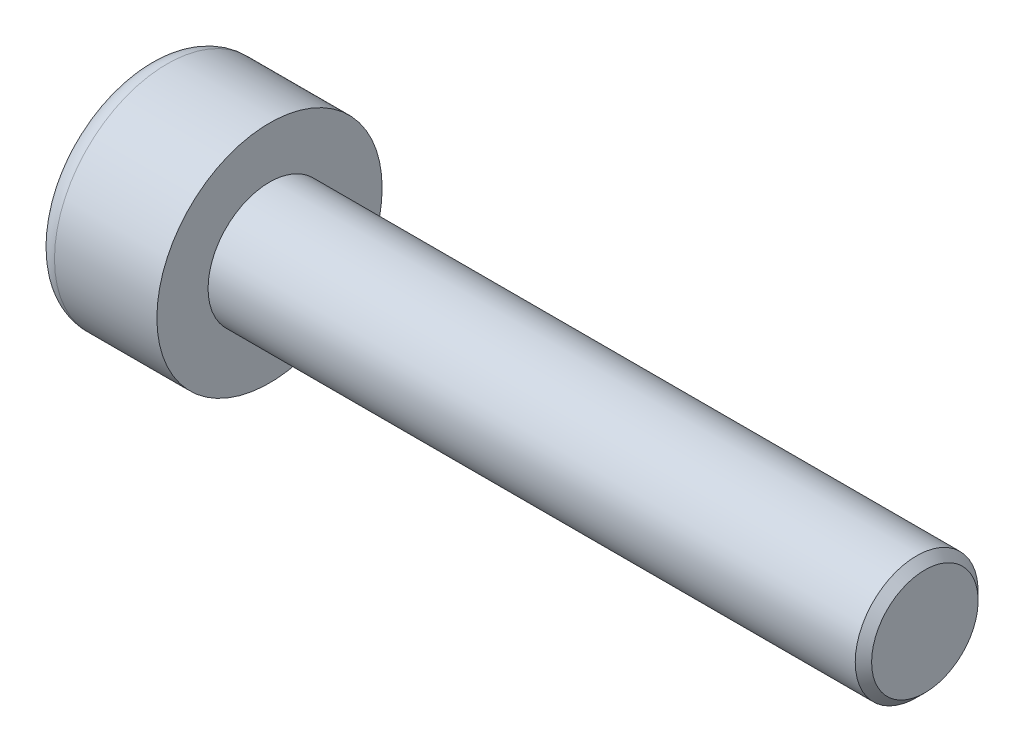
ISO-10303-21;
HEADER;
FILE_DESCRIPTION(('STEP AP214'),'2;1');
FILE_NAME('part.step','',(''),(''),'','','');
FILE_SCHEMA(('AUTOMOTIVE_DESIGN { 1 0 10303 214 1 1 1 1 }'));
ENDSEC;
DATA;
#1=APPLICATION_CONTEXT('core data for automotive mechanical design processes');
#2=APPLICATION_PROTOCOL_DEFINITION('international standard','automotive_design',2000,#1);
#3=PRODUCT_CONTEXT('',#1,'mechanical');
#4=PRODUCT('Part','Part','',(#3));
#5=PRODUCT_RELATED_PRODUCT_CATEGORY('part','',(#4));
#6=PRODUCT_DEFINITION_FORMATION('','',#4);
#7=PRODUCT_DEFINITION_CONTEXT('part definition',#1,'design');
#8=PRODUCT_DEFINITION('design','',#6,#7);
#9=PRODUCT_DEFINITION_SHAPE('','',#8);
#10=(LENGTH_UNIT() NAMED_UNIT(*) SI_UNIT(.MILLI.,.METRE.));
#11=(NAMED_UNIT(*) PLANE_ANGLE_UNIT() SI_UNIT($,.RADIAN.));
#12=(NAMED_UNIT(*) SI_UNIT($,.STERADIAN.) SOLID_ANGLE_UNIT());
#13=UNCERTAINTY_MEASURE_WITH_UNIT(LENGTH_MEASURE(1.E-05),#10,'distance_accuracy_value','');
#14=(GEOMETRIC_REPRESENTATION_CONTEXT(3) GLOBAL_UNCERTAINTY_ASSIGNED_CONTEXT((#13)) GLOBAL_UNIT_ASSIGNED_CONTEXT((#10,
#11,#12)) REPRESENTATION_CONTEXT('',''));
#15=CARTESIAN_POINT('',(0.,0.,0.));
#16=DIRECTION('',(0.,0.,1.));
#17=DIRECTION('',(1.,0.,0.));
#18=AXIS2_PLACEMENT_3D('',#15,#16,#17);
#19=CARTESIAN_POINT('',(0.,0.,0.));
#20=DIRECTION('',(1.,0.,0.));
#21=DIRECTION('',(0.,0.,-1.));
#22=AXIS2_PLACEMENT_3D('',#19,#20,#21);
#23=PLANE('',#22);
#24=DIRECTION('',(0.,0.866025403784439,0.5));
#25=VECTOR('',#24,1.);
#26=CARTESIAN_POINT('',(0.,-1.25,0.721687836487032));
#27=LINE('',#26,#25);
#28=CARTESIAN_POINT('',(0.,-1.25,0.721687836487032));
#29=VERTEX_POINT('',#28);
#30=CARTESIAN_POINT('',(0.,0.,1.44337567297406));
#31=VERTEX_POINT('',#30);
#32=EDGE_CURVE('E91',#29,#31,#27,.T.);
#33=ORIENTED_EDGE('',*,*,#32,.F.);
#34=DIRECTION('',(0.,0.,1.));
#35=VECTOR('',#34,1.);
#36=CARTESIAN_POINT('',(0.,-1.25,-0.721687836487033));
#37=LINE('',#36,#35);
#38=CARTESIAN_POINT('',(0.,-1.25,-0.721687836487033));
#39=VERTEX_POINT('',#38);
#40=EDGE_CURVE('E33',#39,#29,#37,.T.);
#41=ORIENTED_EDGE('',*,*,#40,.F.);
#42=DIRECTION('',(0.,-0.866025403784439,0.5));
#43=VECTOR('',#42,1.);
#44=CARTESIAN_POINT('',(0.,0.,-1.44337567297406));
#45=LINE('',#44,#43);
#46=CARTESIAN_POINT('',(0.,0.,-1.44337567297406));
#47=VERTEX_POINT('',#46);
#48=EDGE_CURVE('E106',#47,#39,#45,.T.);
#49=ORIENTED_EDGE('',*,*,#48,.F.);
#50=DIRECTION('',(0.,-0.866025403784439,-0.5));
#51=VECTOR('',#50,1.);
#52=CARTESIAN_POINT('',(0.,1.25,-0.721687836487033));
#53=LINE('',#52,#51);
#54=CARTESIAN_POINT('',(0.,1.25,-0.721687836487033));
#55=VERTEX_POINT('',#54);
#56=EDGE_CURVE('E100',#55,#47,#53,.T.);
#57=ORIENTED_EDGE('',*,*,#56,.F.);
#58=DIRECTION('',(0.,0.,-1.));
#59=VECTOR('',#58,1.);
#60=CARTESIAN_POINT('',(0.,1.25,0.721687836487032));
#61=LINE('',#60,#59);
#62=CARTESIAN_POINT('',(0.,1.25,0.721687836487032));
#63=VERTEX_POINT('',#62);
#64=EDGE_CURVE('E98',#63,#55,#61,.T.);
#65=ORIENTED_EDGE('',*,*,#64,.F.);
#66=DIRECTION('',(0.,0.866025403784439,-0.5));
#67=VECTOR('',#66,1.);
#68=CARTESIAN_POINT('',(0.,0.,1.44337567297406));
#69=LINE('',#68,#67);
#70=EDGE_CURVE('E84',#31,#63,#69,.T.);
#71=ORIENTED_EDGE('',*,*,#70,.F.);
#72=EDGE_LOOP('',(#33,#41,#49,#57,#65,#71));
#73=FACE_BOUND('',#72,.T.);
#74=CARTESIAN_POINT('',(0.,0.,0.));
#75=DIRECTION('',(-1.,0.,0.));
#76=DIRECTION('',(0.,0.,1.));
#77=AXIS2_PLACEMENT_3D('',#74,#75,#76);
#78=CIRCLE('',#77,2.25);
#79=CARTESIAN_POINT('',(0.,0.,2.25));
#80=VERTEX_POINT('',#79);
#81=EDGE_CURVE('E12',#80,#80,#78,.T.);
#82=ORIENTED_EDGE('',*,*,#81,.T.);
#83=EDGE_LOOP('',(#82));
#84=FACE_BOUND('',#83,.T.);
#85=ADVANCED_FACE('F19',(#73,#84),#23,.F.);
#86=CARTESIAN_POINT('',(0.5,0.,0.));
#87=DIRECTION('',(-1.,0.,0.));
#88=DIRECTION('',(0.,0.,1.));
#89=AXIS2_PLACEMENT_3D('',#86,#87,#88);
#90=TOROIDAL_SURFACE('',#89,2.25,0.5);
#91=ORIENTED_EDGE('',*,*,#81,.F.);
#92=EDGE_LOOP('',(#91));
#93=FACE_BOUND('',#92,.T.);
#94=CARTESIAN_POINT('',(0.5,0.,0.));
#95=DIRECTION('',(-1.,0.,0.));
#96=DIRECTION('',(0.,0.,1.));
#97=AXIS2_PLACEMENT_3D('',#94,#95,#96);
#98=CIRCLE('',#97,2.75);
#99=CARTESIAN_POINT('',(0.5,0.,2.75));
#100=VERTEX_POINT('',#99);
#101=EDGE_CURVE('E26',#100,#100,#98,.T.);
#102=ORIENTED_EDGE('',*,*,#101,.T.);
#103=EDGE_LOOP('',(#102));
#104=FACE_BOUND('',#103,.T.);
#105=ADVANCED_FACE('F132',(#93,#104),#90,.T.);
#106=CARTESIAN_POINT('',(0.,0.,0.));
#107=DIRECTION('',(-1.,0.,0.));
#108=DIRECTION('',(0.,0.,1.));
#109=AXIS2_PLACEMENT_3D('',#106,#107,#108);
#110=CYLINDRICAL_SURFACE('',#109,2.75);
#111=ORIENTED_EDGE('',*,*,#101,.F.);
#112=EDGE_LOOP('',(#111));
#113=FACE_BOUND('',#112,.T.);
#114=CARTESIAN_POINT('',(3.,0.,0.));
#115=DIRECTION('',(-1.,0.,0.));
#116=DIRECTION('',(0.,0.,1.));
#117=AXIS2_PLACEMENT_3D('',#114,#115,#116);
#118=CIRCLE('',#117,2.75);
#119=CARTESIAN_POINT('',(3.,0.,2.75));
#120=VERTEX_POINT('',#119);
#121=EDGE_CURVE('E127',#120,#120,#118,.T.);
#122=ORIENTED_EDGE('',*,*,#121,.T.);
#123=EDGE_LOOP('',(#122));
#124=FACE_BOUND('',#123,.T.);
#125=ADVANCED_FACE('F134',(#113,#124),#110,.T.);
#126=CARTESIAN_POINT('',(3.,2.75,0.));
#127=DIRECTION('',(-1.,0.,0.));
#128=DIRECTION('',(0.,0.,1.));
#129=AXIS2_PLACEMENT_3D('',#126,#127,#128);
#130=PLANE('',#129);
#131=ORIENTED_EDGE('',*,*,#121,.F.);
#132=EDGE_LOOP('',(#131));
#133=FACE_BOUND('',#132,.T.);
#134=CARTESIAN_POINT('',(3.,0.,0.));
#135=DIRECTION('',(-1.,0.,0.));
#136=DIRECTION('',(0.,0.,1.));
#137=AXIS2_PLACEMENT_3D('',#134,#135,#136);
#138=CIRCLE('',#137,1.5);
#139=CARTESIAN_POINT('',(3.,0.,1.5));
#140=VERTEX_POINT('',#139);
#141=EDGE_CURVE('E124',#140,#140,#138,.T.);
#142=ORIENTED_EDGE('',*,*,#141,.T.);
#143=EDGE_LOOP('',(#142));
#144=FACE_BOUND('',#143,.T.);
#145=ADVANCED_FACE('F137',(#133,#144),#130,.F.);
#146=CARTESIAN_POINT('',(0.,0.,0.));
#147=DIRECTION('',(-1.,0.,0.));
#148=DIRECTION('',(0.,0.,1.));
#149=AXIS2_PLACEMENT_3D('',#146,#147,#148);
#150=CYLINDRICAL_SURFACE('',#149,1.5);
#151=ORIENTED_EDGE('',*,*,#141,.F.);
#152=EDGE_LOOP('',(#151));
#153=FACE_BOUND('',#152,.T.);
#154=CARTESIAN_POINT('',(18.8,0.,0.));
#155=DIRECTION('',(-1.,0.,0.));
#156=DIRECTION('',(0.,0.,1.));
#157=AXIS2_PLACEMENT_3D('',#154,#155,#156);
#158=CIRCLE('',#157,1.5);
#159=CARTESIAN_POINT('',(18.8,0.,1.5));
#160=VERTEX_POINT('',#159);
#161=EDGE_CURVE('E121',#160,#160,#158,.T.);
#162=ORIENTED_EDGE('',*,*,#161,.T.);
#163=EDGE_LOOP('',(#162));
#164=FACE_BOUND('',#163,.T.);
#165=ADVANCED_FACE('F143',(#153,#164),#150,.T.);
#166=CARTESIAN_POINT('',(19.,0.,0.));
#167=DIRECTION('',(-1.,0.,0.));
#168=DIRECTION('',(0.,0.,1.));
#169=AXIS2_PLACEMENT_3D('',#166,#167,#168);
#170=CONICAL_SURFACE('',#169,1.3,0.785398163397452);
#171=ORIENTED_EDGE('',*,*,#161,.F.);
#172=EDGE_LOOP('',(#171));
#173=FACE_BOUND('',#172,.T.);
#174=CARTESIAN_POINT('',(19.,0.,0.));
#175=DIRECTION('',(-1.,0.,0.));
#176=DIRECTION('',(0.,0.,1.));
#177=AXIS2_PLACEMENT_3D('',#174,#175,#176);
#178=CIRCLE('',#177,1.3);
#179=CARTESIAN_POINT('',(19.,0.,1.3));
#180=VERTEX_POINT('',#179);
#181=EDGE_CURVE('E118',#180,#180,#178,.T.);
#182=ORIENTED_EDGE('',*,*,#181,.T.);
#183=EDGE_LOOP('',(#182));
#184=FACE_BOUND('',#183,.T.);
#185=ADVANCED_FACE('F149',(#173,#184),#170,.T.);
#186=CARTESIAN_POINT('',(19.,1.3,0.));
#187=DIRECTION('',(-1.,0.,0.));
#188=DIRECTION('',(0.,0.,1.));
#189=AXIS2_PLACEMENT_3D('',#186,#187,#188);
#190=PLANE('',#189);
#191=ORIENTED_EDGE('',*,*,#181,.F.);
#192=EDGE_LOOP('',(#191));
#193=FACE_BOUND('',#192,.T.);
#194=ADVANCED_FACE('F155',(#193),#190,.F.);
#195=CARTESIAN_POINT('',(6.81881307912987,-1.25,-0.721687836487033));
#196=DIRECTION('',(0.,-1.,0.));
#197=DIRECTION('',(0.,0.,-1.));
#198=AXIS2_PLACEMENT_3D('',#195,#196,#197);
#199=PLANE('',#198);
#200=DIRECTION('',(0.,0.,-1.));
#201=VECTOR('',#200,1.);
#202=CARTESIAN_POINT('',(2.5,-1.25,-0.721687836487033));
#203=LINE('',#202,#201);
#204=CARTESIAN_POINT('',(2.5,-1.25,0.721687836487032));
#205=VERTEX_POINT('',#204);
#206=CARTESIAN_POINT('',(2.5,-1.25,-0.721687836487033));
#207=VERTEX_POINT('',#206);
#208=EDGE_CURVE('E52',#205,#207,#203,.T.);
#209=ORIENTED_EDGE('',*,*,#208,.T.);
#210=DIRECTION('',(-1.,0.,0.));
#211=VECTOR('',#210,1.);
#212=CARTESIAN_POINT('',(6.81881307912987,-1.25,-0.721687836487033));
#213=LINE('',#212,#211);
#214=EDGE_CURVE('E109',#207,#39,#213,.T.);
#215=ORIENTED_EDGE('',*,*,#214,.T.);
#216=ORIENTED_EDGE('',*,*,#40,.T.);
#217=DIRECTION('',(-1.,0.,0.));
#218=VECTOR('',#217,1.);
#219=CARTESIAN_POINT('',(6.81881307912987,-1.25,0.721687836487032));
#220=LINE('',#219,#218);
#221=EDGE_CURVE('E88',#205,#29,#220,.T.);
#222=ORIENTED_EDGE('',*,*,#221,.F.);
#223=EDGE_LOOP('',(#209,#215,#216,#222));
#224=FACE_BOUND('',#223,.T.);
#225=ADVANCED_FACE('F160',(#224),#199,.F.);
#226=CARTESIAN_POINT('',(6.81881307912987,0.,-1.44337567297406));
#227=DIRECTION('',(0.,-0.5,-0.866025403784439));
#228=DIRECTION('',(0.,0.866025403784439,-0.5));
#229=AXIS2_PLACEMENT_3D('',#226,#227,#228);
#230=PLANE('',#229);
#231=DIRECTION('',(0.,0.866025403784439,-0.5));
#232=VECTOR('',#231,1.);
#233=CARTESIAN_POINT('',(2.5,0.,-1.44337567297406));
#234=LINE('',#233,#232);
#235=CARTESIAN_POINT('',(2.5,0.,-1.44337567297406));
#236=VERTEX_POINT('',#235);
#237=EDGE_CURVE('E280',#207,#236,#234,.T.);
#238=ORIENTED_EDGE('',*,*,#237,.T.);
#239=DIRECTION('',(-1.,0.,0.));
#240=VECTOR('',#239,1.);
#241=CARTESIAN_POINT('',(6.81881307912987,0.,-1.44337567297406));
#242=LINE('',#241,#240);
#243=EDGE_CURVE('E111',#236,#47,#242,.T.);
#244=ORIENTED_EDGE('',*,*,#243,.T.);
#245=ORIENTED_EDGE('',*,*,#48,.T.);
#246=ORIENTED_EDGE('',*,*,#214,.F.);
#247=EDGE_LOOP('',(#238,#244,#245,#246));
#248=FACE_BOUND('',#247,.T.);
#249=ADVANCED_FACE('F167',(#248),#230,.F.);
#250=CARTESIAN_POINT('',(6.81881307912987,1.25,-0.721687836487033));
#251=DIRECTION('',(0.,0.5,-0.866025403784439));
#252=DIRECTION('',(0.,0.866025403784439,0.5));
#253=AXIS2_PLACEMENT_3D('',#250,#251,#252);
#254=PLANE('',#253);
#255=DIRECTION('',(0.,0.866025403784439,0.5));
#256=VECTOR('',#255,1.);
#257=CARTESIAN_POINT('',(2.5,1.25,-0.721687836487033));
#258=LINE('',#257,#256);
#259=CARTESIAN_POINT('',(2.5,1.25,-0.721687836487033));
#260=VERTEX_POINT('',#259);
#261=EDGE_CURVE('E283',#236,#260,#258,.T.);
#262=ORIENTED_EDGE('',*,*,#261,.T.);
#263=DIRECTION('',(-1.,0.,0.));
#264=VECTOR('',#263,1.);
#265=CARTESIAN_POINT('',(6.81881307912987,1.25,-0.721687836487033));
#266=LINE('',#265,#264);
#267=EDGE_CURVE('E113',#260,#55,#266,.T.);
#268=ORIENTED_EDGE('',*,*,#267,.T.);
#269=ORIENTED_EDGE('',*,*,#56,.T.);
#270=ORIENTED_EDGE('',*,*,#243,.F.);
#271=EDGE_LOOP('',(#262,#268,#269,#270));
#272=FACE_BOUND('',#271,.T.);
#273=ADVANCED_FACE('F231',(#272),#254,.F.);
#274=CARTESIAN_POINT('',(6.81881307912987,1.25,0.721687836487032));
#275=DIRECTION('',(0.,1.,0.));
#276=DIRECTION('',(0.,0.,1.));
#277=AXIS2_PLACEMENT_3D('',#274,#275,#276);
#278=PLANE('',#277);
#279=DIRECTION('',(0.,0.,1.));
#280=VECTOR('',#279,1.);
#281=CARTESIAN_POINT('',(2.5,1.25,0.721687836487032));
#282=LINE('',#281,#280);
#283=CARTESIAN_POINT('',(2.5,1.25,0.721687836487032));
#284=VERTEX_POINT('',#283);
#285=EDGE_CURVE('E42',#260,#284,#282,.T.);
#286=ORIENTED_EDGE('',*,*,#285,.T.);
#287=DIRECTION('',(-1.,0.,0.));
#288=VECTOR('',#287,1.);
#289=CARTESIAN_POINT('',(6.81881307912987,1.25,0.721687836487032));
#290=LINE('',#289,#288);
#291=EDGE_CURVE('E87',#284,#63,#290,.T.);
#292=ORIENTED_EDGE('',*,*,#291,.T.);
#293=ORIENTED_EDGE('',*,*,#64,.T.);
#294=ORIENTED_EDGE('',*,*,#267,.F.);
#295=EDGE_LOOP('',(#286,#292,#293,#294));
#296=FACE_BOUND('',#295,.T.);
#297=ADVANCED_FACE('F239',(#296),#278,.F.);
#298=CARTESIAN_POINT('',(6.81881307912987,0.,1.44337567297406));
#299=DIRECTION('',(0.,0.5,0.866025403784439));
#300=DIRECTION('',(0.,-0.866025403784439,0.5));
#301=AXIS2_PLACEMENT_3D('',#298,#299,#300);
#302=PLANE('',#301);
#303=DIRECTION('',(0.,-0.866025403784439,0.5));
#304=VECTOR('',#303,1.);
#305=CARTESIAN_POINT('',(2.5,0.,1.44337567297406));
#306=LINE('',#305,#304);
#307=CARTESIAN_POINT('',(2.5,0.,1.44337567297406));
#308=VERTEX_POINT('',#307);
#309=EDGE_CURVE('E86',#284,#308,#306,.T.);
#310=ORIENTED_EDGE('',*,*,#309,.T.);
#311=DIRECTION('',(-1.,0.,0.));
#312=VECTOR('',#311,1.);
#313=CARTESIAN_POINT('',(6.81881307912987,0.,1.44337567297406));
#314=LINE('',#313,#312);
#315=EDGE_CURVE('E79',#308,#31,#314,.T.);
#316=ORIENTED_EDGE('',*,*,#315,.T.);
#317=ORIENTED_EDGE('',*,*,#70,.T.);
#318=ORIENTED_EDGE('',*,*,#291,.F.);
#319=EDGE_LOOP('',(#310,#316,#317,#318));
#320=FACE_BOUND('',#319,.T.);
#321=ADVANCED_FACE('F81',(#320),#302,.F.);
#322=CARTESIAN_POINT('',(6.81881307912987,-1.25,0.721687836487032));
#323=DIRECTION('',(0.,-0.5,0.866025403784439));
#324=DIRECTION('',(0.,-0.866025403784439,-0.5));
#325=AXIS2_PLACEMENT_3D('',#322,#323,#324);
#326=PLANE('',#325);
#327=DIRECTION('',(0.,-0.866025403784439,-0.5));
#328=VECTOR('',#327,1.);
#329=CARTESIAN_POINT('',(2.5,-1.25,0.721687836487032));
#330=LINE('',#329,#328);
#331=EDGE_CURVE('E61',#308,#205,#330,.T.);
#332=ORIENTED_EDGE('',*,*,#331,.T.);
#333=ORIENTED_EDGE('',*,*,#221,.T.);
#334=ORIENTED_EDGE('',*,*,#32,.T.);
#335=ORIENTED_EDGE('',*,*,#315,.F.);
#336=EDGE_LOOP('',(#332,#333,#334,#335));
#337=FACE_BOUND('',#336,.T.);
#338=ADVANCED_FACE('F92',(#337),#326,.F.);
#339=CARTESIAN_POINT('',(2.5,2.75,0.));
#340=DIRECTION('',(-1.,0.,0.));
#341=DIRECTION('',(0.,0.,1.));
#342=AXIS2_PLACEMENT_3D('',#339,#340,#341);
#343=PLANE('',#342);
#344=ORIENTED_EDGE('',*,*,#208,.F.);
#345=ORIENTED_EDGE('',*,*,#331,.F.);
#346=ORIENTED_EDGE('',*,*,#309,.F.);
#347=ORIENTED_EDGE('',*,*,#285,.F.);
#348=ORIENTED_EDGE('',*,*,#261,.F.);
#349=ORIENTED_EDGE('',*,*,#237,.F.);
#350=EDGE_LOOP('',(#344,#345,#346,#347,#348,#349));
#351=FACE_BOUND('',#350,.T.);
#352=ADVANCED_FACE('F262',(#351),#343,.T.);
#353=CLOSED_SHELL('',(#85,#105,#125,#145,#165,#185,#194,#225,#249,#273,#297,#321,#338,#352));
#354=MANIFOLD_SOLID_BREP('B1',#353);
#355=ADVANCED_BREP_SHAPE_REPRESENTATION('',(#18,#354),#14);
#356=SHAPE_DEFINITION_REPRESENTATION(#9,#355);
ENDSEC;
END-ISO-10303-21;
